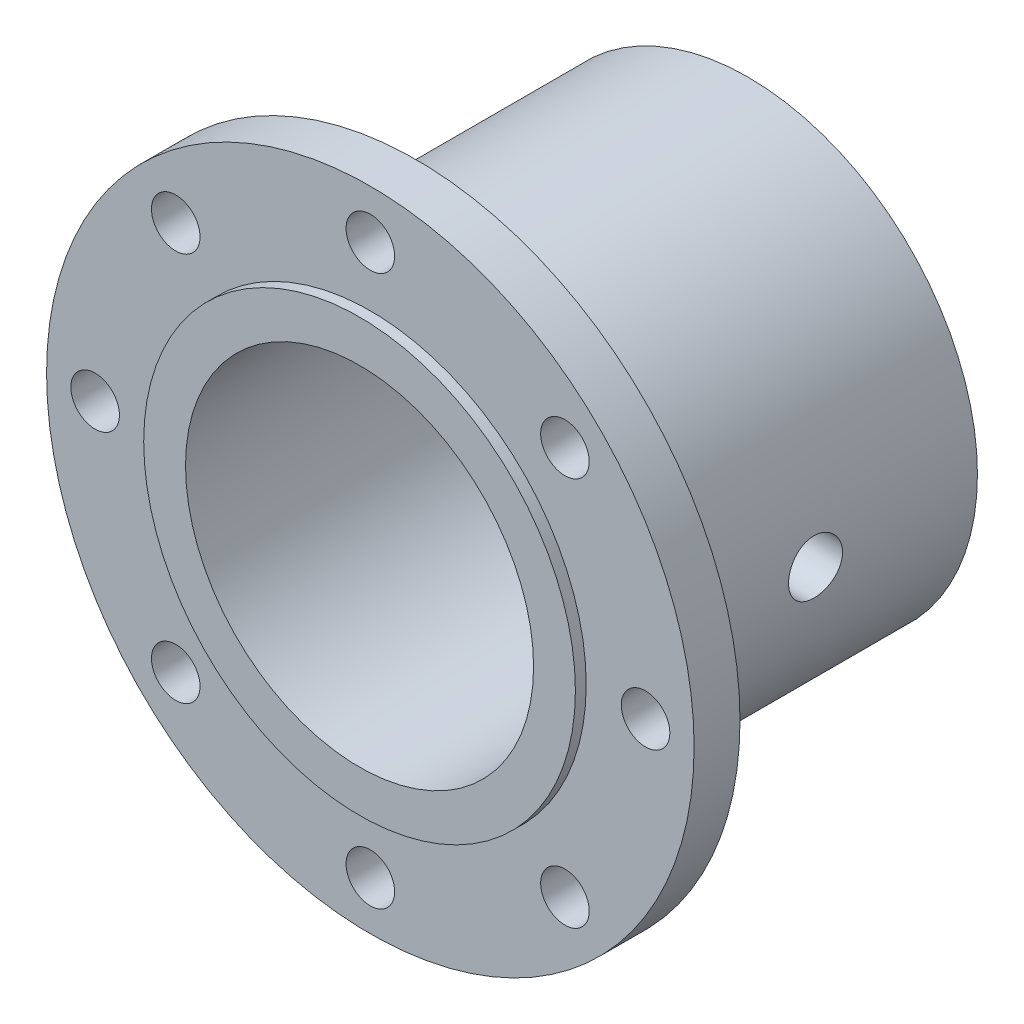
ISO-10303-21;
HEADER;
FILE_DESCRIPTION(('STEP AP214'),'2;1');
FILE_NAME('part.step','',(''),(''),'','','');
FILE_SCHEMA(('AUTOMOTIVE_DESIGN { 1 0 10303 214 1 1 1 1 }'));
ENDSEC;
DATA;
#1=APPLICATION_CONTEXT('core data for automotive mechanical design processes');
#2=APPLICATION_PROTOCOL_DEFINITION('international standard','automotive_design',2000,#1);
#3=PRODUCT_CONTEXT('',#1,'mechanical');
#4=PRODUCT('Part','Part','',(#3));
#5=PRODUCT_RELATED_PRODUCT_CATEGORY('part','',(#4));
#6=PRODUCT_DEFINITION_FORMATION('','',#4);
#7=PRODUCT_DEFINITION_CONTEXT('part definition',#1,'design');
#8=PRODUCT_DEFINITION('design','',#6,#7);
#9=PRODUCT_DEFINITION_SHAPE('','',#8);
#10=(LENGTH_UNIT() NAMED_UNIT(*) SI_UNIT(.MILLI.,.METRE.));
#11=(NAMED_UNIT(*) PLANE_ANGLE_UNIT() SI_UNIT($,.RADIAN.));
#12=(NAMED_UNIT(*) SI_UNIT($,.STERADIAN.) SOLID_ANGLE_UNIT());
#13=UNCERTAINTY_MEASURE_WITH_UNIT(LENGTH_MEASURE(1.E-05),#10,'distance_accuracy_value','');
#14=(GEOMETRIC_REPRESENTATION_CONTEXT(3) GLOBAL_UNCERTAINTY_ASSIGNED_CONTEXT((#13)) GLOBAL_UNIT_ASSIGNED_CONTEXT((#10,
#11,#12)) REPRESENTATION_CONTEXT('',''));
#15=CARTESIAN_POINT('',(0.,0.,0.));
#16=DIRECTION('',(0.,0.,1.));
#17=DIRECTION('',(1.,0.,0.));
#18=AXIS2_PLACEMENT_3D('',#15,#16,#17);
#19=CARTESIAN_POINT('',(0.,-26.5850253807107,81.502538071066));
#20=DIRECTION('',(0.,0.,1.));
#21=DIRECTION('',(1.,0.,0.));
#22=AXIS2_PLACEMENT_3D('',#19,#20,#21);
#23=CYLINDRICAL_SURFACE('',#22,32.25);
#24=CARTESIAN_POINT('',(0.,-26.5850253807107,9.50253807106602));
#25=DIRECTION('',(0.,0.,1.));
#26=DIRECTION('',(1.,0.,0.));
#27=AXIS2_PLACEMENT_3D('',#24,#25,#26);
#28=CIRCLE('',#27,32.25);
#29=CARTESIAN_POINT('',(32.25,-26.5850253807107,9.50253807106602));
#30=VERTEX_POINT('',#29);
#31=EDGE_CURVE('E10',#30,#30,#28,.T.);
#32=ORIENTED_EDGE('',*,*,#31,.F.);
#33=EDGE_LOOP('',(#32));
#34=FACE_BOUND('',#33,.T.);
#35=CARTESIAN_POINT('',(0.,-26.5850253807107,81.502538071066));
#36=DIRECTION('',(0.,0.,1.));
#37=DIRECTION('',(1.,0.,0.));
#38=AXIS2_PLACEMENT_3D('',#35,#36,#37);
#39=CIRCLE('',#38,32.25);
#40=CARTESIAN_POINT('',(32.25,-26.5850253807107,81.502538071066));
#41=VERTEX_POINT('',#40);
#42=EDGE_CURVE('E44',#41,#41,#39,.T.);
#43=ORIENTED_EDGE('',*,*,#42,.T.);
#44=EDGE_LOOP('',(#43));
#45=FACE_BOUND('',#44,.T.);
#46=CARTESIAN_POINT('',(32.25,-26.5850253807107,34.502538071066));
#47=CARTESIAN_POINT('',(32.2500008049657,-26.4454481474943,34.5025360973042));
#48=CARTESIAN_POINT('',(32.2490921571951,-26.30589829624,34.5083845112082));
#49=CARTESIAN_POINT('',(32.2454846816685,-26.0277564048349,34.5317309372004));
#50=CARTESIAN_POINT('',(32.2427854836398,-25.8891645687853,34.5492313588405));
#51=CARTESIAN_POINT('',(32.2356691268618,-25.6138855691107,34.5957682656144));
#52=CARTESIAN_POINT('',(32.2312508242785,-25.4771997365302,34.6248124318412));
#53=CARTESIAN_POINT('',(32.2208187425182,-25.2067439155301,34.6942288433965));
#54=CARTESIAN_POINT('',(32.2148043782711,-25.0729750158725,34.7346052431069));
#55=CARTESIAN_POINT('',(32.2013570157093,-24.8095004563843,34.8263272775792));
#56=CARTESIAN_POINT('',(32.1939256598882,-24.6797902925829,34.8776602203016));
#57=CARTESIAN_POINT('',(32.1778436448224,-24.4251262047364,34.9909678473588));
#58=CARTESIAN_POINT('',(32.1691925365285,-24.3001740539572,35.0529464527126));
#59=CARTESIAN_POINT('',(32.1509177149112,-24.0559991387111,35.1870522363706));
#60=CARTESIAN_POINT('',(32.1412945015894,-23.936773474924,35.2591742048558));
#61=CARTESIAN_POINT('',(32.1213339411527,-23.7047525615352,35.4131104261228));
#62=CARTESIAN_POINT('',(32.1109963294611,-23.5919597228581,35.4949282778714));
#63=CARTESIAN_POINT('',(32.0898207056942,-23.3728438512416,35.6682789343979));
#64=CARTESIAN_POINT('',(32.0789796692962,-23.266572271025,35.7598764119589));
#65=CARTESIAN_POINT('',(32.0571653941962,-23.0620680803102,35.9517023795468));
#66=CARTESIAN_POINT('',(32.04619210805,-22.9638384596704,36.0519340514485));
#67=CARTESIAN_POINT('',(32.02442874292,-22.7761689753479,36.2602760252548));
#68=CARTESIAN_POINT('',(32.0136386085292,-22.6867264127367,36.3683838901217));
#69=CARTESIAN_POINT('',(31.9925382821566,-22.5171885324636,36.5918034887296));
#70=CARTESIAN_POINT('',(31.9822282686634,-22.437096674581,36.7071178648183));
#71=CARTESIAN_POINT('',(31.9623360784381,-22.2864938441379,36.9447060105157));
#72=CARTESIAN_POINT('',(31.9527577391024,-22.2160320341773,37.0670112772423));
#73=CARTESIAN_POINT('',(31.9346585772014,-22.0856459097479,37.3172463686424));
#74=CARTESIAN_POINT('',(31.9261381495238,-22.0257255266281,37.4451782695886));
#75=CARTESIAN_POINT('',(31.9104109626834,-21.9169205321263,37.7056790844832));
#76=CARTESIAN_POINT('',(31.9032036585578,-21.8680313406438,37.8382460474723));
#77=CARTESIAN_POINT('',(31.8903057130665,-21.781611759624,38.1071180180789));
#78=CARTESIAN_POINT('',(31.8846156265532,-21.7440855248862,38.2434243731641));
#79=CARTESIAN_POINT('',(31.8701765170131,-21.6495805961384,38.6541891963233));
#80=CARTESIAN_POINT('',(31.8639095265525,-21.6096791571703,38.9328883642247));
#81=CARTESIAN_POINT('',(31.8588142822097,-21.5771621703979,39.4929387931502));
#82=CARTESIAN_POINT('',(31.8599855723919,-21.5845437243429,39.7742898905664));
#83=CARTESIAN_POINT('',(31.8695721253563,-21.6460163005565,40.3292082217962));
#84=CARTESIAN_POINT('',(31.8779229877265,-21.6996920794825,40.6028223834758));
#85=CARTESIAN_POINT('',(31.9008305190764,-21.8515957030713,41.1371027047395));
#86=CARTESIAN_POINT('',(31.9153873745528,-21.9498248866164,41.3977684749479));
#87=CARTESIAN_POINT('',(31.9491364951109,-22.1884713085155,41.9000236829084));
#88=CARTESIAN_POINT('',(31.9683479137364,-22.329063468764,42.1415286770164));
#89=CARTESIAN_POINT('',(32.0092280812238,-22.6483216793557,42.5976760083632));
#90=CARTESIAN_POINT('',(32.0308970021504,-22.8269903964418,42.8123164624358));
#91=CARTESIAN_POINT('',(32.0745347650476,-23.2196047142342,43.2110492362858));
#92=CARTESIAN_POINT('',(32.0965043358498,-23.4339072159363,43.394790235128));
#93=CARTESIAN_POINT('',(32.1380530375296,-23.8904922494791,43.723753779962));
#94=CARTESIAN_POINT('',(32.1576321566041,-24.1327749194636,43.8689761357677));
#95=CARTESIAN_POINT('',(32.1922164253769,-24.6387547949145,44.1168022407714));
#96=CARTESIAN_POINT('',(32.2072185412989,-24.9024660579129,44.2193777386073));
#97=CARTESIAN_POINT('',(32.2309334273698,-25.4436564317002,44.3786869429534));
#98=CARTESIAN_POINT('',(32.2396466520489,-25.7211345459392,44.4354239624789));
#99=CARTESIAN_POINT('',(32.2497415439993,-26.2789510656303,44.5009758454051));
#100=CARTESIAN_POINT('',(32.2511970694901,-26.5592314477053,44.5102734998191));
#101=CARTESIAN_POINT('',(32.2468139766676,-27.1173477828296,44.4819658486629));
#102=CARTESIAN_POINT('',(32.2409756000702,-27.3951838165758,44.4443620973792));
#103=CARTESIAN_POINT('',(32.222706394102,-27.9390539063974,44.3237205894323));
#104=CARTESIAN_POINT('',(32.210309865556,-28.2051416353539,44.2409191572799));
#105=CARTESIAN_POINT('',(32.1803094874894,-28.7196580327636,44.0324826507239));
#106=CARTESIAN_POINT('',(32.1627053791212,-28.9680858226521,43.9068454470817));
#107=CARTESIAN_POINT('',(32.1240616306813,-29.4423458349654,43.6151792498853));
#108=CARTESIAN_POINT('',(32.1029964719419,-29.6679884331683,43.4488453659814));
#109=CARTESIAN_POINT('',(32.0598517311511,-30.0883291395657,43.080929407399));
#110=CARTESIAN_POINT('',(32.0377720859491,-30.2830253180104,42.8793451362299));
#111=CARTESIAN_POINT('',(31.9948511929802,-30.6377131578543,42.4445003557043));
#112=CARTESIAN_POINT('',(31.9740227202341,-30.7973804252765,42.2109738203425));
#113=CARTESIAN_POINT('',(31.9361928168575,-31.0752188180593,41.7201199751697));
#114=CARTESIAN_POINT('',(31.9191912773742,-31.1933911237505,41.4627933426191));
#115=CARTESIAN_POINT('',(31.8910317782357,-31.3843922748693,40.9326467024447));
#116=CARTESIAN_POINT('',(31.8798521932421,-31.4573891153599,40.6598882642918));
#117=CARTESIAN_POINT('',(31.8645530067509,-31.5564823410298,40.1056407016935));
#118=CARTESIAN_POINT('',(31.860432881318,-31.5825822067915,39.8241522267483));
#119=CARTESIAN_POINT('',(31.8598916732344,-31.5859931830601,39.4034342973351));
#120=CARTESIAN_POINT('',(31.8606338638982,-31.5812829786356,39.2641283655716));
#121=CARTESIAN_POINT('',(31.8639241729542,-31.5602623039631,38.9864300225694));
#122=CARTESIAN_POINT('',(31.8664716146857,-31.5439561801957,38.848037288649));
#123=CARTESIAN_POINT('',(31.8733030067324,-31.4998543187573,38.5730979909165));
#124=CARTESIAN_POINT('',(31.8775875808227,-31.4720544538071,38.436552108497));
#125=CARTESIAN_POINT('',(31.8877666307192,-31.4051896341428,38.1663588173385));
#126=CARTESIAN_POINT('',(31.8936605251979,-31.3661287469129,38.032710380749));
#127=CARTESIAN_POINT('',(31.9068867530392,-31.2770506951853,37.7692683536935));
#128=CARTESIAN_POINT('',(31.914218339989,-31.2270392143879,37.6394728029989));
#129=CARTESIAN_POINT('',(31.9301105737695,-31.1164332399221,37.3846066741019));
#130=CARTESIAN_POINT('',(31.9386707783792,-31.0558425523751,37.2595344161993));
#131=CARTESIAN_POINT('',(31.9567846338447,-30.9244736856796,37.0148734608468));
#132=CARTESIAN_POINT('',(31.9663386661872,-30.8536915904628,36.8952868946829));
#133=CARTESIAN_POINT('',(31.9861667644985,-30.7024815849243,36.6625008522807));
#134=CARTESIAN_POINT('',(31.9964405750166,-30.6220570895733,36.5492991355355));
#135=CARTESIAN_POINT('',(32.0175381379552,-30.451191132944,36.3288306165629));
#136=CARTESIAN_POINT('',(32.0283665815385,-30.3606521238869,36.2216398497806));
#137=CARTESIAN_POINT('',(32.0501620212102,-30.1709319092793,36.0152882523546));
#138=CARTESIAN_POINT('',(32.0611289661898,-30.0717538163353,35.91612455425));
#139=CARTESIAN_POINT('',(32.0829043479623,-29.8653487548849,35.7264105991851));
#140=CARTESIAN_POINT('',(32.0937126859724,-29.7581170052379,35.6358655322451));
#141=CARTESIAN_POINT('',(32.1148574402583,-29.5364355603456,35.4641187284882));
#142=CARTESIAN_POINT('',(32.1251940293302,-29.4219885451469,35.3829135537383));
#143=CARTESIAN_POINT('',(32.1451729244147,-29.1858864263259,35.2299001622348));
#144=CARTESIAN_POINT('',(32.1548104515176,-29.0641904914511,35.1581543019506));
#145=CARTESIAN_POINT('',(32.173041857303,-28.8151508044138,35.0252109707331));
#146=CARTESIAN_POINT('',(32.181636119328,-28.6878091503676,34.9640096217834));
#147=CARTESIAN_POINT('',(32.1975346848956,-28.4284254244429,34.8526154361496));
#148=CARTESIAN_POINT('',(32.2048399175884,-28.2963868213654,34.8024146637322));
#149=CARTESIAN_POINT('',(32.2179582902288,-28.0285127588914,34.7133554485813));
#150=CARTESIAN_POINT('',(32.223771760142,-27.8926781465249,34.6744944973114));
#151=CARTESIAN_POINT('',(32.2357027346184,-27.5640801264141,34.5953856805266));
#152=CARTESIAN_POINT('',(32.2410399912731,-27.3699448379168,34.560607431701));
#153=CARTESIAN_POINT('',(32.2481880319922,-26.9788633051952,34.5141851779653));
#154=CARTESIAN_POINT('',(32.2499988644919,-26.7819170996161,34.502540855312));
#155=CARTESIAN_POINT('',(32.25,-26.5850253807107,34.502538071066));
#156=B_SPLINE_CURVE_WITH_KNOTS('',3,(#46,#47,#48,#49,#50,#51,#52,#53,#54,#55,#56,#57,#58,#59,
#60,#61,#62,#63,#64,#65,#66,#67,#68,#69,#70,#71,#72,#73,#74,#75,#76,#77,#78,#79,#80,#81,#82,#83,
#84,#85,#86,#87,#88,#89,#90,#91,#92,#93,#94,#95,#96,#97,#98,#99,#100,#101,#102,#103,#104,#105,
#106,#107,#108,#109,#110,#111,#112,#113,#114,#115,#116,#117,#118,#119,#120,#121,#122,#123,#124,
#125,#126,#127,#128,#129,#130,#131,#132,#133,#134,#135,#136,#137,#138,#139,#140,#141,#142,#143,
#144,#145,#146,#147,#148,#149,#150,#151,#152,#153,#154,#155),.UNSPECIFIED.,.T.,.F.,(4,2,2,2,2,2,
2,2,2,2,2,2,2,2,2,2,2,2,2,2,2,2,2,2,2,2,2,2,2,2,2,2,2,2,2,2,2,2,2,2,2,2,2,2,2,2,2,2,2,2,2,2,2,2,
4),(0.,0.418559208301783,0.837204998548023,1.25612981914887,1.67520841809215,2.09380416662646,
2.51255442459472,2.93109038484553,3.34978218887463,3.77143794675545,4.19324976354513,
4.61493161388497,5.03676899617177,5.46068531314037,5.88475939302394,6.30865707395184,
6.73270956397875,7.57312000672253,8.41347893629324,9.24637761001535,10.0793013149844,
10.9157125230907,11.7521823296428,12.5975995474782,13.443020939491,14.289001491005,
15.1349208930809,15.9722139442779,16.8094792487861,17.6424081153239,18.4753783903107,
19.3147911868194,20.1542563067193,21.0011949070163,21.8481094140618,22.6918552518271,
23.5355384661875,23.9532939744351,24.370892978504,24.7886420683135,25.2062404556804,
25.6236226080487,26.0408549055143,26.4582479552955,26.8754936146247,27.2971823894809,
27.7187198560796,28.1405095817174,28.5621435499536,28.9864310848488,29.4105622424073,
29.8343864202589,30.2581167707265,30.8485567158258,31.4389885512133),.UNSPECIFIED.);
#157=CARTESIAN_POINT('',(32.25,-26.5850253807107,34.502538071066));
#158=VERTEX_POINT('',#157);
#159=EDGE_CURVE('E62',#158,#158,#156,.T.);
#160=ORIENTED_EDGE('',*,*,#159,.T.);
#161=EDGE_LOOP('',(#160));
#162=FACE_BOUND('',#161,.T.);
#163=ADVANCED_FACE('F31',(#34,#45,#162),#23,.F.);
#164=CARTESIAN_POINT('',(0.,-26.5850253807107,81.502538071066));
#165=DIRECTION('',(0.,0.,1.));
#166=DIRECTION('',(1.,0.,0.));
#167=AXIS2_PLACEMENT_3D('',#164,#165,#166);
#168=CYLINDRICAL_SURFACE('',#167,42.5);
#169=CARTESIAN_POINT('',(0.,-26.5850253807107,71.002538071066));
#170=DIRECTION('',(0.,0.,1.));
#171=DIRECTION('',(1.,0.,0.));
#172=AXIS2_PLACEMENT_3D('',#169,#170,#171);
#173=CIRCLE('',#172,42.5);
#174=CARTESIAN_POINT('',(42.5,-26.5850253807107,71.002538071066));
#175=VERTEX_POINT('',#174);
#176=EDGE_CURVE('E100',#175,#175,#173,.T.);
#177=ORIENTED_EDGE('',*,*,#176,.F.);
#178=EDGE_LOOP('',(#177));
#179=FACE_BOUND('',#178,.T.);
#180=CARTESIAN_POINT('',(0.,-26.5850253807107,9.50253807106602));
#181=DIRECTION('',(0.,0.,1.));
#182=DIRECTION('',(1.,0.,0.));
#183=AXIS2_PLACEMENT_3D('',#180,#181,#182);
#184=CIRCLE('',#183,42.5);
#185=CARTESIAN_POINT('',(42.5,-26.5850253807107,9.50253807106602));
#186=VERTEX_POINT('',#185);
#187=EDGE_CURVE('E97',#186,#186,#184,.T.);
#188=ORIENTED_EDGE('',*,*,#187,.T.);
#189=EDGE_LOOP('',(#188));
#190=FACE_BOUND('',#189,.T.);
#191=CARTESIAN_POINT('',(42.5,-26.5850253807107,34.502538071066));
#192=CARTESIAN_POINT('',(42.5000004852367,-26.7249821200556,34.502536539427));
#193=CARTESIAN_POINT('',(42.4993072903455,-26.8649160976885,34.5084165738431));
#194=CARTESIAN_POINT('',(42.4965549147535,-27.1438288908736,34.5318920350661));
#195=CARTESIAN_POINT('',(42.49449541872,-27.2828074784456,34.5494901663303));
#196=CARTESIAN_POINT('',(42.489065608902,-27.5588757500149,34.5962936629271));
#197=CARTESIAN_POINT('',(42.4856942971876,-27.6959639135165,34.6255078652567));
#198=CARTESIAN_POINT('',(42.4777347532229,-27.9672222229913,34.6953400679));
#199=CARTESIAN_POINT('',(42.4731460753883,-28.101391281008,34.735962244117));
#200=CARTESIAN_POINT('',(42.4628869102071,-28.3656733844283,34.8282612174374));
#201=CARTESIAN_POINT('',(42.4572175365287,-28.495790446257,34.8799266409536));
#202=CARTESIAN_POINT('',(42.4449507550646,-28.7512468726704,34.9939841531755));
#203=CARTESIAN_POINT('',(42.4383530056718,-28.876584456913,35.0563801922292));
#204=CARTESIAN_POINT('',(42.4244197727099,-29.1214882980021,35.1914016396598));
#205=CARTESIAN_POINT('',(42.417084701025,-29.2410577224222,35.2640213458595));
#206=CARTESIAN_POINT('',(42.4018758847743,-29.4737135142928,35.4190313131502));
#207=CARTESIAN_POINT('',(42.3940019413706,-29.5867974600723,35.5014251891204));
#208=CARTESIAN_POINT('',(42.3779055382328,-29.8060904745239,35.6757331054001));
#209=CARTESIAN_POINT('',(42.3696818088799,-29.9122701924695,35.7676839557549));
#210=CARTESIAN_POINT('',(42.3531440272471,-30.1165546828843,35.9602211936892));
#211=CARTESIAN_POINT('',(42.3448299426927,-30.2146564549441,36.0608107618785));
#212=CARTESIAN_POINT('',(42.3283516800634,-30.4020253538557,36.2698600849248));
#213=CARTESIAN_POINT('',(42.3201874550902,-30.4912952843801,36.3783173231135));
#214=CARTESIAN_POINT('',(42.3042340575092,-30.6604397392938,36.6024151750503));
#215=CARTESIAN_POINT('',(42.296445024386,-30.7403107851526,36.718058424299));
#216=CARTESIAN_POINT('',(42.2814468647638,-30.8902484505256,36.9559956315594));
#217=CARTESIAN_POINT('',(42.2742393034562,-30.9602889598619,37.0783061462651));
#218=CARTESIAN_POINT('',(42.2606307511772,-31.0898375247189,37.3284817103992));
#219=CARTESIAN_POINT('',(42.2542300603376,-31.1493416643344,37.4563488030666));
#220=CARTESIAN_POINT('',(42.2424255752181,-31.2573311257701,37.7166504203163));
#221=CARTESIAN_POINT('',(42.2370213868457,-31.3058208053082,37.8490831146132));
#222=CARTESIAN_POINT('',(42.2273599853977,-31.3914687683823,38.1176183567603));
#223=CARTESIAN_POINT('',(42.2231031939586,-31.4286228870742,38.2537222335122));
#224=CARTESIAN_POINT('',(42.2122922044816,-31.5222869560586,38.6647125104253));
#225=CARTESIAN_POINT('',(42.2076268489857,-31.5616222915333,38.9437858386191));
#226=CARTESIAN_POINT('',(42.2039248712986,-31.5929132509341,39.5044567117164));
#227=CARTESIAN_POINT('',(42.2048880476991,-31.5848705702091,39.7860541659379));
#228=CARTESIAN_POINT('',(42.2123029062406,-31.5218733853088,40.3424679368274));
#229=CARTESIAN_POINT('',(42.2187268793369,-31.4671557134086,40.6173112935391));
#230=CARTESIAN_POINT('',(42.2362988603762,-31.3127143711443,41.1538763028881));
#231=CARTESIAN_POINT('',(42.2474469540028,-31.2129898844672,41.41559771743));
#232=CARTESIAN_POINT('',(42.2732419778817,-30.9711133622592,41.9192426498367));
#233=CARTESIAN_POINT('',(42.2878974361015,-30.828857701003,42.1611159527129));
#234=CARTESIAN_POINT('',(42.3190493116535,-30.5060299895554,42.6176451411025));
#235=CARTESIAN_POINT('',(42.3355458035936,-30.3254563862625,42.8322999228321));
#236=CARTESIAN_POINT('',(42.3686443060393,-29.9298027839562,43.2296753026135));
#237=CARTESIAN_POINT('',(42.3852463447339,-29.7145184634526,43.412192524687));
#238=CARTESIAN_POINT('',(42.4165906622039,-29.2562598628648,43.7385302902306));
#239=CARTESIAN_POINT('',(42.4313329374818,-29.013285530708,43.8823507609274));
#240=CARTESIAN_POINT('',(42.4573043731317,-28.5063922847775,44.1272100690829));
#241=CARTESIAN_POINT('',(42.4685325504652,-28.2424675361446,44.22823693819));
#242=CARTESIAN_POINT('',(42.486201475368,-27.7012390466457,44.3844837324003));
#243=CARTESIAN_POINT('',(42.4926424213401,-27.423935860745,44.4397055558655));
#244=CARTESIAN_POINT('',(42.4999854795144,-26.8655814784893,44.5025128989095));
#245=CARTESIAN_POINT('',(42.5009201840467,-26.5845622250968,44.5103787323315));
#246=CARTESIAN_POINT('',(42.4972332514729,-26.0252095414604,44.4789894451932));
#247=CARTESIAN_POINT('',(42.4926117189065,-25.7468760607833,44.4397352111902));
#248=CARTESIAN_POINT('',(42.4783520425119,-25.2016171838971,44.31545287011));
#249=CARTESIAN_POINT('',(42.4687284661571,-24.9346610830276,44.2305576589267));
#250=CARTESIAN_POINT('',(42.4455427834462,-24.4187762359808,44.0175408152978));
#251=CARTESIAN_POINT('',(42.4319805574226,-24.1698480378306,43.8894178694495));
#252=CARTESIAN_POINT('',(42.4023498393325,-23.695828297908,43.5928991918042));
#253=CARTESIAN_POINT('',(42.3862701246873,-23.4708514607111,43.4243212325749));
#254=CARTESIAN_POINT('',(42.3534404183234,-23.0522859468644,43.0519357310002));
#255=CARTESIAN_POINT('',(42.3366904031506,-22.8586983697277,42.8481269550949));
#256=CARTESIAN_POINT('',(42.3043080310039,-22.5074184003866,42.4098378195182));
#257=CARTESIAN_POINT('',(42.2886817124291,-22.3499112466971,42.1752084988326));
#258=CARTESIAN_POINT('',(42.2604135356385,-22.076542267687,41.6826510901919));
#259=CARTESIAN_POINT('',(42.2477716234433,-21.9606796891167,41.4247234237531));
#260=CARTESIAN_POINT('',(42.2269423244611,-21.774186746544,40.8935531279463));
#261=CARTESIAN_POINT('',(42.2187444805097,-21.7034501283781,40.6203481344788));
#262=CARTESIAN_POINT('',(42.2077063847631,-21.6088932705395,40.065681774273));
#263=CARTESIAN_POINT('',(42.2048659143513,-21.5850711164425,39.7842207449119));
#264=CARTESIAN_POINT('',(42.2048533791663,-21.585002667838,39.3631764127912));
#265=CARTESIAN_POINT('',(42.2055500936664,-21.5908640459355,39.2233744021047));
#266=CARTESIAN_POINT('',(42.2083139258824,-21.6142701946419,38.9447795459334));
#267=CARTESIAN_POINT('',(42.2103805336913,-21.631810618041,38.8059863443719));
#268=CARTESIAN_POINT('',(42.2158281839392,-21.678459127132,38.5303422667424));
#269=CARTESIAN_POINT('',(42.2192097056155,-21.7075714304288,38.3934921177152));
#270=CARTESIAN_POINT('',(42.2271880105448,-21.7771340730258,38.1227916989967));
#271=CARTESIAN_POINT('',(42.2317843509907,-21.8175802813882,37.9889403554725));
#272=CARTESIAN_POINT('',(42.2420623490345,-21.9095247690673,37.7251213077998));
#273=CARTESIAN_POINT('',(42.2477440922653,-21.9610239204478,37.5951539110123));
#274=CARTESIAN_POINT('',(42.2600289826327,-22.0746801251208,37.3400684158965));
#275=CARTESIAN_POINT('',(42.2666317944474,-22.136833301611,37.2149485738658));
#276=CARTESIAN_POINT('',(42.280576423252,-22.2713921529053,36.9703332475552));
#277=CARTESIAN_POINT('',(42.2879185077017,-22.3438015421623,36.850839821956));
#278=CARTESIAN_POINT('',(42.3031303319185,-22.4983169298378,36.6183945788336));
#279=CARTESIAN_POINT('',(42.3109998808013,-22.5804194285177,36.5054404220992));
#280=CARTESIAN_POINT('',(42.3270990600424,-22.7543133468094,36.2861187754494));
#281=CARTESIAN_POINT('',(42.3353306401591,-22.846162335398,36.1797970680542));
#282=CARTESIAN_POINT('',(42.3518717175877,-23.0384401335343,35.9752978200937));
#283=CARTESIAN_POINT('',(42.3601811855058,-23.1388658139164,35.8771173347915));
#284=CARTESIAN_POINT('',(42.3766518335608,-23.3476881154808,35.6894865110067));
#285=CARTESIAN_POINT('',(42.3848129209159,-23.4560895236306,35.6000414916725));
#286=CARTESIAN_POINT('',(42.4007486418851,-23.680011413264,35.4306099365585));
#287=CARTESIAN_POINT('',(42.4085234171271,-23.7955292504458,35.3506199193801));
#288=CARTESIAN_POINT('',(42.4234988937163,-24.0333614470594,35.2003442382268));
#289=CARTESIAN_POINT('',(42.4306973231478,-24.1556997608883,35.1300962502041));
#290=CARTESIAN_POINT('',(42.4442803354381,-24.4058623699762,35.0001935539886));
#291=CARTESIAN_POINT('',(42.4506652164651,-24.5336846322566,34.9405349615764));
#292=CARTESIAN_POINT('',(42.4624378735847,-24.793850839871,34.8322567249817));
#293=CARTESIAN_POINT('',(42.4678264392439,-24.9261911053538,34.7836283325208));
#294=CARTESIAN_POINT('',(42.4774582944082,-25.1944988190006,34.6977196276836));
#295=CARTESIAN_POINT('',(42.4817018575821,-25.3304653918829,34.6604366033602));
#296=CARTESIAN_POINT('',(42.4901239627925,-25.6507785687271,34.5870113787367));
#297=CARTESIAN_POINT('',(42.4938122419506,-25.836186989067,34.5553658006474));
#298=CARTESIAN_POINT('',(42.4987499273919,-26.2094190685571,34.513130240257));
#299=CARTESIAN_POINT('',(42.4999993489485,-26.3972427125745,34.5025401260957));
#300=CARTESIAN_POINT('',(42.5,-26.5850253807107,34.502538071066));
#301=B_SPLINE_CURVE_WITH_KNOTS('',3,(#191,#192,#193,#194,#195,#196,#197,#198,#199,#200,#201,
#202,#203,#204,#205,#206,#207,#208,#209,#210,#211,#212,#213,#214,#215,#216,#217,#218,#219,#220,
#221,#222,#223,#224,#225,#226,#227,#228,#229,#230,#231,#232,#233,#234,#235,#236,#237,#238,#239,
#240,#241,#242,#243,#244,#245,#246,#247,#248,#249,#250,#251,#252,#253,#254,#255,#256,#257,#258,
#259,#260,#261,#262,#263,#264,#265,#266,#267,#268,#269,#270,#271,#272,#273,#274,#275,#276,#277,
#278,#279,#280,#281,#282,#283,#284,#285,#286,#287,#288,#289,#290,#291,#292,#293,#294,#295,#296,
#297,#298,#299,#300),.UNSPECIFIED.,.T.,.F.,(4,2,2,2,2,2,2,2,2,2,2,2,2,2,2,2,2,2,2,2,2,2,2,2,2,2,
2,2,2,2,2,2,2,2,2,2,2,2,2,2,2,2,2,2,2,2,2,2,2,2,2,2,2,2,4),(0.,0.419705927393633,
0.839508753659034,1.25963156040855,1.67990835454619,2.09975436790555,2.51975527472718,
2.93952285032082,3.35944615963643,3.78105142233138,4.20281258297503,4.62443942279372,
5.04622181933081,5.46910409965664,5.8921432183469,6.31501467484931,6.73804131367339,
7.57925611076024,8.42044080646477,9.25738248751384,10.0943393492357,10.9333522798734,
11.7723992238533,12.6165786833157,13.4607597303349,14.3051767190623,15.1495587096985,
15.9889376051337,16.8283007080192,17.665232914282,18.5021905516245,19.3429914226351,
20.1838217391307,21.0288767169739,21.8739164090473,22.716958943457,23.5599670753745,
23.979338625655,24.3985541633775,24.8179226329579,25.237138451105,25.6563873570359,
26.0754840286536,26.4947328728406,26.9138308057209,27.3355587637689,27.757133508357,
28.1789633758426,28.6006374355357,29.02389931023,29.4470056090223,29.8697751509083,
30.2924435562869,30.8555746553906,31.4187022278632),.UNSPECIFIED.);
#302=CARTESIAN_POINT('',(42.5,-26.5850253807107,34.502538071066));
#303=VERTEX_POINT('',#302);
#304=EDGE_CURVE('E35',#303,#303,#301,.T.);
#305=ORIENTED_EDGE('',*,*,#304,.T.);
#306=EDGE_LOOP('',(#305));
#307=FACE_BOUND('',#306,.T.);
#308=ADVANCED_FACE('F131',(#179,#190,#307),#168,.T.);
#309=CARTESIAN_POINT('',(0.,15.9149746192894,9.50253807106602));
#310=DIRECTION('',(0.,0.,-1.));
#311=DIRECTION('',(-1.,0.,0.));
#312=AXIS2_PLACEMENT_3D('',#309,#310,#311);
#313=PLANE('',#312);
#314=ORIENTED_EDGE('',*,*,#31,.T.);
#315=EDGE_LOOP('',(#314));
#316=FACE_BOUND('',#315,.T.);
#317=ORIENTED_EDGE('',*,*,#187,.F.);
#318=EDGE_LOOP('',(#317));
#319=FACE_BOUND('',#318,.T.);
#320=ADVANCED_FACE('F33',(#316,#319),#313,.T.);
#321=CARTESIAN_POINT('',(0.,5.66497461928935,81.502538071066));
#322=DIRECTION('',(0.,0.,1.));
#323=DIRECTION('',(1.,0.,0.));
#324=AXIS2_PLACEMENT_3D('',#321,#322,#323);
#325=PLANE('',#324);
#326=CARTESIAN_POINT('',(0.,-26.5850253807107,81.502538071066));
#327=DIRECTION('',(0.,0.,1.));
#328=DIRECTION('',(1.,0.,0.));
#329=AXIS2_PLACEMENT_3D('',#326,#327,#328);
#330=CIRCLE('',#329,40.);
#331=CARTESIAN_POINT('',(40.,-26.5850253807107,81.502538071066));
#332=VERTEX_POINT('',#331);
#333=EDGE_CURVE('E49',#332,#332,#330,.T.);
#334=ORIENTED_EDGE('',*,*,#333,.T.);
#335=EDGE_LOOP('',(#334));
#336=FACE_BOUND('',#335,.T.);
#337=ORIENTED_EDGE('',*,*,#42,.F.);
#338=EDGE_LOOP('',(#337));
#339=FACE_BOUND('',#338,.T.);
#340=ADVANCED_FACE('F114',(#336,#339),#325,.T.);
#341=CARTESIAN_POINT('',(0.,-26.5850253807107,81.502538071066));
#342=DIRECTION('',(0.,0.,1.));
#343=DIRECTION('',(1.,0.,0.));
#344=AXIS2_PLACEMENT_3D('',#341,#342,#343);
#345=CYLINDRICAL_SURFACE('',#344,40.);
#346=CARTESIAN_POINT('',(0.,-26.5850253807107,79.502538071066));
#347=DIRECTION('',(0.,0.,1.));
#348=DIRECTION('',(1.,0.,0.));
#349=AXIS2_PLACEMENT_3D('',#346,#347,#348);
#350=CIRCLE('',#349,40.);
#351=CARTESIAN_POINT('',(40.,-26.5850253807107,79.502538071066));
#352=VERTEX_POINT('',#351);
#353=EDGE_CURVE('E109',#352,#352,#350,.T.);
#354=ORIENTED_EDGE('',*,*,#353,.T.);
#355=EDGE_LOOP('',(#354));
#356=FACE_BOUND('',#355,.T.);
#357=ORIENTED_EDGE('',*,*,#333,.F.);
#358=EDGE_LOOP('',(#357));
#359=FACE_BOUND('',#358,.T.);
#360=ADVANCED_FACE('F117',(#356,#359),#345,.T.);
#361=CARTESIAN_POINT('',(0.,13.4149746192894,79.502538071066));
#362=DIRECTION('',(0.,0.,1.));
#363=DIRECTION('',(1.,0.,0.));
#364=AXIS2_PLACEMENT_3D('',#361,#362,#363);
#365=PLANE('',#364);
#366=CARTESIAN_POINT('',(-1.76941794549634E-13,-77.5850253807106,79.502538071066));
#367=DIRECTION('',(0.,0.,1.));
#368=DIRECTION('',(1.,0.,0.));
#369=AXIS2_PLACEMENT_3D('',#366,#367,#368);
#370=CIRCLE('',#369,4.5);
#371=CARTESIAN_POINT('',(4.49999999999982,-77.5850253807106,79.502538071066));
#372=VERTEX_POINT('',#371);
#373=EDGE_CURVE('E57',#372,#372,#370,.T.);
#374=ORIENTED_EDGE('',*,*,#373,.F.);
#375=EDGE_LOOP('',(#374));
#376=FACE_BOUND('',#375,.T.);
#377=CARTESIAN_POINT('',(-36.0624458405141,-62.6474712212244,79.502538071066));
#378=DIRECTION('',(0.,0.,1.));
#379=DIRECTION('',(1.,0.,0.));
#380=AXIS2_PLACEMENT_3D('',#377,#378,#379);
#381=CIRCLE('',#380,4.5);
#382=CARTESIAN_POINT('',(-31.5624458405141,-62.6474712212244,79.502538071066));
#383=VERTEX_POINT('',#382);
#384=EDGE_CURVE('E81',#383,#383,#381,.T.);
#385=ORIENTED_EDGE('',*,*,#384,.F.);
#386=EDGE_LOOP('',(#385));
#387=FACE_BOUND('',#386,.T.);
#388=CARTESIAN_POINT('',(-51.,-26.5850253807107,79.502538071066));
#389=DIRECTION('',(0.,0.,1.));
#390=DIRECTION('',(1.,0.,0.));
#391=AXIS2_PLACEMENT_3D('',#388,#389,#390);
#392=CIRCLE('',#391,4.5);
#393=CARTESIAN_POINT('',(-46.5,-26.5850253807107,79.502538071066));
#394=VERTEX_POINT('',#393);
#395=EDGE_CURVE('E78',#394,#394,#392,.T.);
#396=ORIENTED_EDGE('',*,*,#395,.F.);
#397=EDGE_LOOP('',(#396));
#398=FACE_BOUND('',#397,.T.);
#399=CARTESIAN_POINT('',(-36.0624458405136,9.47742045980358,79.502538071066));
#400=DIRECTION('',(0.,0.,1.));
#401=DIRECTION('',(1.,0.,0.));
#402=AXIS2_PLACEMENT_3D('',#399,#400,#401);
#403=CIRCLE('',#402,4.5);
#404=CARTESIAN_POINT('',(-31.5624458405136,9.47742045980358,79.502538071066));
#405=VERTEX_POINT('',#404);
#406=EDGE_CURVE('E74',#405,#405,#403,.T.);
#407=ORIENTED_EDGE('',*,*,#406,.F.);
#408=EDGE_LOOP('',(#407));
#409=FACE_BOUND('',#408,.T.);
#410=CARTESIAN_POINT('',(5.34294830600857E-13,24.4149746192893,79.502538071066));
#411=DIRECTION('',(0.,0.,1.));
#412=DIRECTION('',(1.,0.,0.));
#413=AXIS2_PLACEMENT_3D('',#410,#411,#412);
#414=CIRCLE('',#413,4.5);
#415=CARTESIAN_POINT('',(4.50000000000053,24.4149746192893,79.502538071066));
#416=VERTEX_POINT('',#415);
#417=EDGE_CURVE('E70',#416,#416,#414,.T.);
#418=ORIENTED_EDGE('',*,*,#417,.F.);
#419=EDGE_LOOP('',(#418));
#420=FACE_BOUND('',#419,.T.);
#421=CARTESIAN_POINT('',(36.0624458405143,9.47742045980283,79.502538071066));
#422=DIRECTION('',(0.,0.,1.));
#423=DIRECTION('',(1.,0.,0.));
#424=AXIS2_PLACEMENT_3D('',#421,#422,#423);
#425=CIRCLE('',#424,4.5);
#426=CARTESIAN_POINT('',(40.5624458405143,9.47742045980283,79.502538071066));
#427=VERTEX_POINT('',#426);
#428=EDGE_CURVE('E66',#427,#427,#425,.T.);
#429=ORIENTED_EDGE('',*,*,#428,.F.);
#430=EDGE_LOOP('',(#429));
#431=FACE_BOUND('',#430,.T.);
#432=CARTESIAN_POINT('',(36.0624458405139,-62.6474712212246,79.502538071066));
#433=DIRECTION('',(0.,0.,1.));
#434=DIRECTION('',(1.,0.,0.));
#435=AXIS2_PLACEMENT_3D('',#432,#433,#434);
#436=CIRCLE('',#435,4.5);
#437=CARTESIAN_POINT('',(40.5624458405139,-62.6474712212246,79.502538071066));
#438=VERTEX_POINT('',#437);
#439=EDGE_CURVE('E61',#438,#438,#436,.T.);
#440=ORIENTED_EDGE('',*,*,#439,.F.);
#441=EDGE_LOOP('',(#440));
#442=FACE_BOUND('',#441,.T.);
#443=CARTESIAN_POINT('',(51.,-26.5850253807107,79.502538071066));
#444=DIRECTION('',(0.,0.,1.));
#445=DIRECTION('',(1.,0.,0.));
#446=AXIS2_PLACEMENT_3D('',#443,#444,#445);
#447=CIRCLE('',#446,4.5);
#448=CARTESIAN_POINT('',(55.5,-26.5850253807107,79.502538071066));
#449=VERTEX_POINT('',#448);
#450=EDGE_CURVE('E56',#449,#449,#447,.T.);
#451=ORIENTED_EDGE('',*,*,#450,.F.);
#452=EDGE_LOOP('',(#451));
#453=FACE_BOUND('',#452,.T.);
#454=CARTESIAN_POINT('',(0.,-26.5850253807107,79.502538071066));
#455=DIRECTION('',(0.,0.,1.));
#456=DIRECTION('',(1.,0.,0.));
#457=AXIS2_PLACEMENT_3D('',#454,#455,#456);
#458=CIRCLE('',#457,60.);
#459=CARTESIAN_POINT('',(60.,-26.5850253807107,79.502538071066));
#460=VERTEX_POINT('',#459);
#461=EDGE_CURVE('E106',#460,#460,#458,.T.);
#462=ORIENTED_EDGE('',*,*,#461,.T.);
#463=EDGE_LOOP('',(#462));
#464=FACE_BOUND('',#463,.T.);
#465=ORIENTED_EDGE('',*,*,#353,.F.);
#466=EDGE_LOOP('',(#465));
#467=FACE_BOUND('',#466,.T.);
#468=ADVANCED_FACE('F119',(#376,#387,#398,#409,#420,#431,#442,#453,#464,#467),#365,.T.);
#469=CARTESIAN_POINT('',(0.,-26.5850253807107,81.502538071066));
#470=DIRECTION('',(0.,0.,1.));
#471=DIRECTION('',(1.,0.,0.));
#472=AXIS2_PLACEMENT_3D('',#469,#470,#471);
#473=CYLINDRICAL_SURFACE('',#472,60.);
#474=CARTESIAN_POINT('',(0.,-26.5850253807107,71.002538071066));
#475=DIRECTION('',(0.,0.,1.));
#476=DIRECTION('',(1.,0.,0.));
#477=AXIS2_PLACEMENT_3D('',#474,#475,#476);
#478=CIRCLE('',#477,60.);
#479=CARTESIAN_POINT('',(60.,-26.5850253807107,71.002538071066));
#480=VERTEX_POINT('',#479);
#481=EDGE_CURVE('E103',#480,#480,#478,.T.);
#482=ORIENTED_EDGE('',*,*,#481,.T.);
#483=EDGE_LOOP('',(#482));
#484=FACE_BOUND('',#483,.T.);
#485=ORIENTED_EDGE('',*,*,#461,.F.);
#486=EDGE_LOOP('',(#485));
#487=FACE_BOUND('',#486,.T.);
#488=ADVANCED_FACE('F126',(#484,#487),#473,.T.);
#489=CARTESIAN_POINT('',(0.,33.4149746192893,71.002538071066));
#490=DIRECTION('',(0.,0.,-1.));
#491=DIRECTION('',(-1.,0.,0.));
#492=AXIS2_PLACEMENT_3D('',#489,#490,#491);
#493=PLANE('',#492);
#494=CARTESIAN_POINT('',(-1.76941794549634E-13,-77.5850253807106,71.002538071066));
#495=DIRECTION('',(0.,0.,-1.));
#496=DIRECTION('',(-1.,0.,0.));
#497=AXIS2_PLACEMENT_3D('',#494,#495,#496);
#498=CIRCLE('',#497,4.5);
#499=CARTESIAN_POINT('',(-4.50000000000017,-77.5850253807106,71.002538071066));
#500=VERTEX_POINT('',#499);
#501=EDGE_CURVE('E82',#500,#500,#498,.T.);
#502=ORIENTED_EDGE('',*,*,#501,.F.);
#503=EDGE_LOOP('',(#502));
#504=FACE_BOUND('',#503,.T.);
#505=CARTESIAN_POINT('',(-36.0624458405141,-62.6474712212244,71.002538071066));
#506=DIRECTION('',(0.,0.,-1.));
#507=DIRECTION('',(-1.,0.,0.));
#508=AXIS2_PLACEMENT_3D('',#505,#506,#507);
#509=CIRCLE('',#508,4.5);
#510=CARTESIAN_POINT('',(-40.5624458405141,-62.6474712212244,71.002538071066));
#511=VERTEX_POINT('',#510);
#512=EDGE_CURVE('E79',#511,#511,#509,.T.);
#513=ORIENTED_EDGE('',*,*,#512,.F.);
#514=EDGE_LOOP('',(#513));
#515=FACE_BOUND('',#514,.T.);
#516=CARTESIAN_POINT('',(-51.,-26.5850253807107,71.002538071066));
#517=DIRECTION('',(0.,0.,-1.));
#518=DIRECTION('',(-1.,0.,0.));
#519=AXIS2_PLACEMENT_3D('',#516,#517,#518);
#520=CIRCLE('',#519,4.5);
#521=CARTESIAN_POINT('',(-55.5,-26.5850253807107,71.002538071066));
#522=VERTEX_POINT('',#521);
#523=EDGE_CURVE('E75',#522,#522,#520,.T.);
#524=ORIENTED_EDGE('',*,*,#523,.F.);
#525=EDGE_LOOP('',(#524));
#526=FACE_BOUND('',#525,.T.);
#527=CARTESIAN_POINT('',(-36.0624458405136,9.47742045980358,71.002538071066));
#528=DIRECTION('',(0.,0.,-1.));
#529=DIRECTION('',(-1.,0.,0.));
#530=AXIS2_PLACEMENT_3D('',#527,#528,#529);
#531=CIRCLE('',#530,4.5);
#532=CARTESIAN_POINT('',(-40.5624458405136,9.47742045980358,71.002538071066));
#533=VERTEX_POINT('',#532);
#534=EDGE_CURVE('E71',#533,#533,#531,.T.);
#535=ORIENTED_EDGE('',*,*,#534,.F.);
#536=EDGE_LOOP('',(#535));
#537=FACE_BOUND('',#536,.T.);
#538=CARTESIAN_POINT('',(5.34294830600857E-13,24.4149746192893,71.002538071066));
#539=DIRECTION('',(0.,0.,-1.));
#540=DIRECTION('',(-1.,0.,0.));
#541=AXIS2_PLACEMENT_3D('',#538,#539,#540);
#542=CIRCLE('',#541,4.5);
#543=CARTESIAN_POINT('',(-4.49999999999946,24.4149746192893,71.002538071066));
#544=VERTEX_POINT('',#543);
#545=EDGE_CURVE('E67',#544,#544,#542,.T.);
#546=ORIENTED_EDGE('',*,*,#545,.F.);
#547=EDGE_LOOP('',(#546));
#548=FACE_BOUND('',#547,.T.);
#549=CARTESIAN_POINT('',(36.0624458405143,9.47742045980283,71.002538071066));
#550=DIRECTION('',(0.,0.,-1.));
#551=DIRECTION('',(-1.,0.,0.));
#552=AXIS2_PLACEMENT_3D('',#549,#550,#551);
#553=CIRCLE('',#552,4.5);
#554=CARTESIAN_POINT('',(31.5624458405144,9.47742045980283,71.002538071066));
#555=VERTEX_POINT('',#554);
#556=EDGE_CURVE('E63',#555,#555,#553,.T.);
#557=ORIENTED_EDGE('',*,*,#556,.F.);
#558=EDGE_LOOP('',(#557));
#559=FACE_BOUND('',#558,.T.);
#560=CARTESIAN_POINT('',(36.0624458405139,-62.6474712212246,71.002538071066));
#561=DIRECTION('',(0.,0.,-1.));
#562=DIRECTION('',(-1.,0.,0.));
#563=AXIS2_PLACEMENT_3D('',#560,#561,#562);
#564=CIRCLE('',#563,4.5);
#565=CARTESIAN_POINT('',(31.5624458405139,-62.6474712212246,71.002538071066));
#566=VERTEX_POINT('',#565);
#567=EDGE_CURVE('E58',#566,#566,#564,.T.);
#568=ORIENTED_EDGE('',*,*,#567,.F.);
#569=EDGE_LOOP('',(#568));
#570=FACE_BOUND('',#569,.T.);
#571=CARTESIAN_POINT('',(51.,-26.5850253807107,71.002538071066));
#572=DIRECTION('',(0.,0.,-1.));
#573=DIRECTION('',(-1.,0.,0.));
#574=AXIS2_PLACEMENT_3D('',#571,#572,#573);
#575=CIRCLE('',#574,4.5);
#576=CARTESIAN_POINT('',(46.5,-26.5850253807107,71.002538071066));
#577=VERTEX_POINT('',#576);
#578=EDGE_CURVE('E53',#577,#577,#575,.T.);
#579=ORIENTED_EDGE('',*,*,#578,.F.);
#580=EDGE_LOOP('',(#579));
#581=FACE_BOUND('',#580,.T.);
#582=ORIENTED_EDGE('',*,*,#176,.T.);
#583=EDGE_LOOP('',(#582));
#584=FACE_BOUND('',#583,.T.);
#585=ORIENTED_EDGE('',*,*,#481,.F.);
#586=EDGE_LOOP('',(#585));
#587=FACE_BOUND('',#586,.T.);
#588=ADVANCED_FACE('F182',(#504,#515,#526,#537,#548,#559,#570,#581,#584,#587),#493,.T.);
#589=CARTESIAN_POINT('',(51.,-26.5850253807107,9.50253807106602));
#590=DIRECTION('',(0.,0.,1.));
#591=DIRECTION('',(1.,0.,0.));
#592=AXIS2_PLACEMENT_3D('',#589,#590,#591);
#593=CYLINDRICAL_SURFACE('',#592,4.5);
#594=ORIENTED_EDGE('',*,*,#450,.T.);
#595=EDGE_LOOP('',(#594));
#596=FACE_BOUND('',#595,.T.);
#597=ORIENTED_EDGE('',*,*,#578,.T.);
#598=EDGE_LOOP('',(#597));
#599=FACE_BOUND('',#598,.T.);
#600=ADVANCED_FACE('F179',(#596,#599),#593,.F.);
#601=CARTESIAN_POINT('',(36.0624458405139,-62.6474712212246,9.50253807106602));
#602=DIRECTION('',(0.,0.,1.));
#603=DIRECTION('',(1.,0.,0.));
#604=AXIS2_PLACEMENT_3D('',#601,#602,#603);
#605=CYLINDRICAL_SURFACE('',#604,4.5);
#606=ORIENTED_EDGE('',*,*,#439,.T.);
#607=EDGE_LOOP('',(#606));
#608=FACE_BOUND('',#607,.T.);
#609=ORIENTED_EDGE('',*,*,#567,.T.);
#610=EDGE_LOOP('',(#609));
#611=FACE_BOUND('',#610,.T.);
#612=ADVANCED_FACE('F162',(#608,#611),#605,.F.);
#613=CARTESIAN_POINT('',(36.0624458405143,9.47742045980283,9.50253807106602));
#614=DIRECTION('',(0.,0.,1.));
#615=DIRECTION('',(1.,0.,0.));
#616=AXIS2_PLACEMENT_3D('',#613,#614,#615);
#617=CYLINDRICAL_SURFACE('',#616,4.5);
#618=ORIENTED_EDGE('',*,*,#428,.T.);
#619=EDGE_LOOP('',(#618));
#620=FACE_BOUND('',#619,.T.);
#621=ORIENTED_EDGE('',*,*,#556,.T.);
#622=EDGE_LOOP('',(#621));
#623=FACE_BOUND('',#622,.T.);
#624=ADVANCED_FACE('F158',(#620,#623),#617,.F.);
#625=CARTESIAN_POINT('',(5.34294830600857E-13,24.4149746192893,9.50253807106602));
#626=DIRECTION('',(0.,0.,1.));
#627=DIRECTION('',(1.,0.,0.));
#628=AXIS2_PLACEMENT_3D('',#625,#626,#627);
#629=CYLINDRICAL_SURFACE('',#628,4.5);
#630=ORIENTED_EDGE('',*,*,#417,.T.);
#631=EDGE_LOOP('',(#630));
#632=FACE_BOUND('',#631,.T.);
#633=ORIENTED_EDGE('',*,*,#545,.T.);
#634=EDGE_LOOP('',(#633));
#635=FACE_BOUND('',#634,.T.);
#636=ADVANCED_FACE('F153',(#632,#635),#629,.F.);
#637=CARTESIAN_POINT('',(-36.0624458405136,9.47742045980358,9.50253807106602));
#638=DIRECTION('',(0.,0.,1.));
#639=DIRECTION('',(1.,0.,0.));
#640=AXIS2_PLACEMENT_3D('',#637,#638,#639);
#641=CYLINDRICAL_SURFACE('',#640,4.5);
#642=ORIENTED_EDGE('',*,*,#406,.T.);
#643=EDGE_LOOP('',(#642));
#644=FACE_BOUND('',#643,.T.);
#645=ORIENTED_EDGE('',*,*,#534,.T.);
#646=EDGE_LOOP('',(#645));
#647=FACE_BOUND('',#646,.T.);
#648=ADVANCED_FACE('F157',(#644,#647),#641,.F.);
#649=CARTESIAN_POINT('',(-51.,-26.5850253807107,9.50253807106602));
#650=DIRECTION('',(0.,0.,1.));
#651=DIRECTION('',(1.,0.,0.));
#652=AXIS2_PLACEMENT_3D('',#649,#650,#651);
#653=CYLINDRICAL_SURFACE('',#652,4.5);
#654=ORIENTED_EDGE('',*,*,#395,.T.);
#655=EDGE_LOOP('',(#654));
#656=FACE_BOUND('',#655,.T.);
#657=ORIENTED_EDGE('',*,*,#523,.T.);
#658=EDGE_LOOP('',(#657));
#659=FACE_BOUND('',#658,.T.);
#660=ADVANCED_FACE('F170',(#656,#659),#653,.F.);
#661=CARTESIAN_POINT('',(-36.0624458405141,-62.6474712212244,9.50253807106602));
#662=DIRECTION('',(0.,0.,1.));
#663=DIRECTION('',(1.,0.,0.));
#664=AXIS2_PLACEMENT_3D('',#661,#662,#663);
#665=CYLINDRICAL_SURFACE('',#664,4.5);
#666=ORIENTED_EDGE('',*,*,#384,.T.);
#667=EDGE_LOOP('',(#666));
#668=FACE_BOUND('',#667,.T.);
#669=ORIENTED_EDGE('',*,*,#512,.T.);
#670=EDGE_LOOP('',(#669));
#671=FACE_BOUND('',#670,.T.);
#672=ADVANCED_FACE('F166',(#668,#671),#665,.F.);
#673=CARTESIAN_POINT('',(-1.76941794549634E-13,-77.5850253807106,9.50253807106602));
#674=DIRECTION('',(0.,0.,1.));
#675=DIRECTION('',(1.,0.,0.));
#676=AXIS2_PLACEMENT_3D('',#673,#674,#675);
#677=CYLINDRICAL_SURFACE('',#676,4.5);
#678=ORIENTED_EDGE('',*,*,#373,.T.);
#679=EDGE_LOOP('',(#678));
#680=FACE_BOUND('',#679,.T.);
#681=ORIENTED_EDGE('',*,*,#501,.T.);
#682=EDGE_LOOP('',(#681));
#683=FACE_BOUND('',#682,.T.);
#684=ADVANCED_FACE('F151',(#680,#683),#677,.F.);
#685=CARTESIAN_POINT('',(70.,-26.5850253807107,39.502538071066));
#686=DIRECTION('',(-1.,0.,0.));
#687=DIRECTION('',(0.,0.,1.));
#688=AXIS2_PLACEMENT_3D('',#685,#686,#687);
#689=CYLINDRICAL_SURFACE('',#688,5.);
#690=ORIENTED_EDGE('',*,*,#159,.F.);
#691=EDGE_LOOP('',(#690));
#692=FACE_BOUND('',#691,.T.);
#693=ORIENTED_EDGE('',*,*,#304,.F.);
#694=EDGE_LOOP('',(#693));
#695=FACE_BOUND('',#694,.T.);
#696=ADVANCED_FACE('F147',(#692,#695),#689,.F.);
#697=CLOSED_SHELL('',(#163,#308,#320,#340,#360,#468,#488,#588,#600,#612,#624,#636,#648,#660,
#672,#684,#696));
#698=MANIFOLD_SOLID_BREP('B2',#697);
#699=ADVANCED_BREP_SHAPE_REPRESENTATION('',(#18,#698),#14);
#700=SHAPE_DEFINITION_REPRESENTATION(#9,#699);
ENDSEC;
END-ISO-10303-21;
